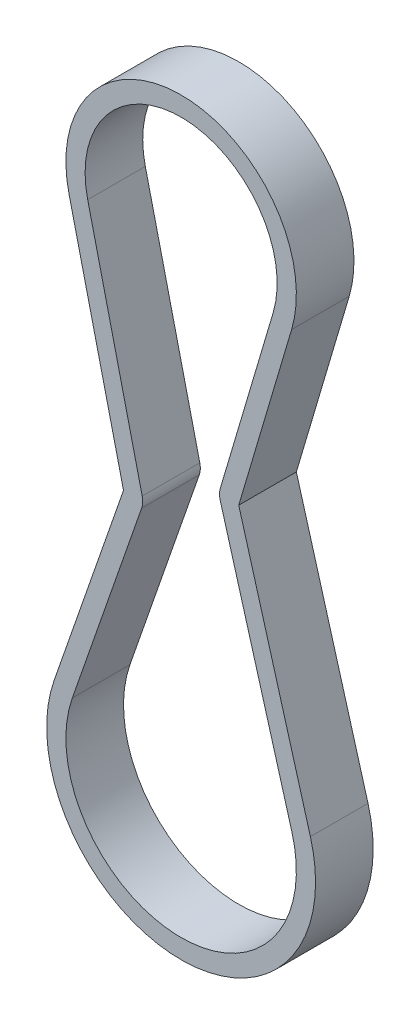
ISO-10303-21;
HEADER;
FILE_DESCRIPTION(('STEP AP214'),'2;1');
FILE_NAME('part.step','',(''),(''),'','','');
FILE_SCHEMA(('AUTOMOTIVE_DESIGN { 1 0 10303 214 1 1 1 1 }'));
ENDSEC;
DATA;
#1=APPLICATION_CONTEXT('core data for automotive mechanical design processes');
#2=APPLICATION_PROTOCOL_DEFINITION('international standard','automotive_design',2000,#1);
#3=PRODUCT_CONTEXT('',#1,'mechanical');
#4=PRODUCT('Part','Part','',(#3));
#5=PRODUCT_RELATED_PRODUCT_CATEGORY('part','',(#4));
#6=PRODUCT_DEFINITION_FORMATION('','',#4);
#7=PRODUCT_DEFINITION_CONTEXT('part definition',#1,'design');
#8=PRODUCT_DEFINITION('design','',#6,#7);
#9=PRODUCT_DEFINITION_SHAPE('','',#8);
#10=(LENGTH_UNIT() NAMED_UNIT(*) SI_UNIT(.MILLI.,.METRE.));
#11=(NAMED_UNIT(*) PLANE_ANGLE_UNIT() SI_UNIT($,.RADIAN.));
#12=(NAMED_UNIT(*) SI_UNIT($,.STERADIAN.) SOLID_ANGLE_UNIT());
#13=UNCERTAINTY_MEASURE_WITH_UNIT(LENGTH_MEASURE(1.E-05),#10,'distance_accuracy_value','');
#14=(GEOMETRIC_REPRESENTATION_CONTEXT(3) GLOBAL_UNCERTAINTY_ASSIGNED_CONTEXT((#13)) GLOBAL_UNIT_ASSIGNED_CONTEXT((#10,
#11,#12)) REPRESENTATION_CONTEXT('',''));
#15=CARTESIAN_POINT('',(0.,0.,0.));
#16=DIRECTION('',(0.,0.,1.));
#17=DIRECTION('',(1.,0.,0.));
#18=AXIS2_PLACEMENT_3D('',#15,#16,#17);
#19=CARTESIAN_POINT('',(17.259086334899,23.4276246371151,9.));
#20=DIRECTION('',(0.958838129716609,-0.283953237350016,0.));
#21=DIRECTION('',(0.283953237350016,0.958838129716609,0.));
#22=AXIS2_PLACEMENT_3D('',#19,#20,#21);
#23=PLANE('',#22);
#24=DIRECTION('',(-0.283953237350016,-0.95883812971661,0.));
#25=VECTOR('',#24,1.);
#26=CARTESIAN_POINT('',(17.259086334899,23.4276246371151,0.));
#27=LINE('',#26,#25);
#28=CARTESIAN_POINT('',(17.259086334899,23.4276246371151,0.));
#29=VERTEX_POINT('',#28);
#30=CARTESIAN_POINT('',(9.00000000000001,-4.46121709058456,0.));
#31=VERTEX_POINT('',#30);
#32=EDGE_CURVE('E187',#29,#31,#27,.T.);
#33=ORIENTED_EDGE('',*,*,#32,.F.);
#34=DIRECTION('',(0.,0.,-1.));
#35=VECTOR('',#34,1.);
#36=CARTESIAN_POINT('',(17.259086334899,23.4276246371151,9.));
#37=LINE('',#36,#35);
#38=CARTESIAN_POINT('',(17.259086334899,23.4276246371151,9.));
#39=VERTEX_POINT('',#38);
#40=EDGE_CURVE('E12',#39,#29,#37,.T.);
#41=ORIENTED_EDGE('',*,*,#40,.F.);
#42=DIRECTION('',(-0.283953237350016,-0.95883812971661,0.));
#43=VECTOR('',#42,1.);
#44=CARTESIAN_POINT('',(17.259086334899,23.4276246371151,9.));
#45=LINE('',#44,#43);
#46=CARTESIAN_POINT('',(9.00000000000001,-4.46121709058456,9.));
#47=VERTEX_POINT('',#46);
#48=EDGE_CURVE('E245',#39,#47,#45,.T.);
#49=ORIENTED_EDGE('',*,*,#48,.T.);
#50=DIRECTION('',(0.,0.,-1.));
#51=VECTOR('',#50,1.);
#52=CARTESIAN_POINT('',(9.00000000000001,-4.46121709058456,9.));
#53=LINE('',#52,#51);
#54=EDGE_CURVE('E80',#47,#31,#53,.T.);
#55=ORIENTED_EDGE('',*,*,#54,.T.);
#56=EDGE_LOOP('',(#33,#41,#49,#55));
#57=FACE_BOUND('',#56,.T.);
#58=ADVANCED_FACE('F77',(#57),#23,.T.);
#59=CARTESIAN_POINT('',(0.,28.5387829094154,9.));
#60=DIRECTION('',(0.,0.,-1.));
#61=DIRECTION('',(-1.,0.,0.));
#62=AXIS2_PLACEMENT_3D('',#59,#60,#61);
#63=CYLINDRICAL_SURFACE('',#62,18.);
#64=CARTESIAN_POINT('',(0.,28.5387829094154,0.));
#65=DIRECTION('',(0.,0.,1.));
#66=DIRECTION('',(1.,0.,0.));
#67=AXIS2_PLACEMENT_3D('',#64,#65,#66);
#68=CIRCLE('',#67,18.);
#69=CARTESIAN_POINT('',(-17.5127818305813,24.3791588212962,0.));
#70=VERTEX_POINT('',#69);
#71=EDGE_CURVE('E249',#29,#70,#68,.T.);
#72=ORIENTED_EDGE('',*,*,#71,.T.);
#73=DIRECTION('',(0.,0.,-1.));
#74=VECTOR('',#73,1.);
#75=CARTESIAN_POINT('',(-17.5127818305813,24.3791588212962,9.));
#76=LINE('',#75,#74);
#77=CARTESIAN_POINT('',(-17.5127818305813,24.3791588212962,9.));
#78=VERTEX_POINT('',#77);
#79=EDGE_CURVE('E85',#78,#70,#76,.T.);
#80=ORIENTED_EDGE('',*,*,#79,.F.);
#81=CARTESIAN_POINT('',(0.,28.5387829094154,9.));
#82=DIRECTION('',(0.,0.,1.));
#83=DIRECTION('',(1.,0.,0.));
#84=AXIS2_PLACEMENT_3D('',#81,#82,#83);
#85=CIRCLE('',#84,18.);
#86=EDGE_CURVE('E258',#39,#78,#85,.T.);
#87=ORIENTED_EDGE('',*,*,#86,.F.);
#88=ORIENTED_EDGE('',*,*,#40,.T.);
#89=EDGE_LOOP('',(#72,#80,#87,#88));
#90=FACE_BOUND('',#89,.T.);
#91=ADVANCED_FACE('F297',(#90),#63,.T.);
#92=CARTESIAN_POINT('',(-17.5127818305813,24.3791588212962,9.));
#93=DIRECTION('',(0.972932323921183,0.231090227117734,0.));
#94=DIRECTION('',(-0.231090227117734,0.972932323921183,0.));
#95=AXIS2_PLACEMENT_3D('',#92,#93,#94);
#96=PLANE('',#95);
#97=DIRECTION('',(0.231090227117734,-0.972932323921183,0.));
#98=VECTOR('',#97,1.);
#99=CARTESIAN_POINT('',(-17.5127818305813,24.3791588212962,0.));
#100=LINE('',#99,#98);
#101=CARTESIAN_POINT('',(-9.,-11.4612170905846,0.));
#102=VERTEX_POINT('',#101);
#103=EDGE_CURVE('E270',#70,#102,#100,.T.);
#104=ORIENTED_EDGE('',*,*,#103,.T.);
#105=DIRECTION('',(0.,0.,-1.));
#106=VECTOR('',#105,1.);
#107=CARTESIAN_POINT('',(-9.,-11.4612170905846,9.));
#108=LINE('',#107,#106);
#109=CARTESIAN_POINT('',(-9.,-11.4612170905846,9.));
#110=VERTEX_POINT('',#109);
#111=EDGE_CURVE('E275',#110,#102,#108,.T.);
#112=ORIENTED_EDGE('',*,*,#111,.F.);
#113=DIRECTION('',(0.231090227117734,-0.972932323921183,0.));
#114=VECTOR('',#113,1.);
#115=CARTESIAN_POINT('',(-17.5127818305813,24.3791588212962,9.));
#116=LINE('',#115,#114);
#117=EDGE_CURVE('E256',#78,#110,#116,.T.);
#118=ORIENTED_EDGE('',*,*,#117,.F.);
#119=ORIENTED_EDGE('',*,*,#79,.T.);
#120=EDGE_LOOP('',(#104,#112,#118,#119));
#121=FACE_BOUND('',#120,.T.);
#122=ADVANCED_FACE('F301',(#121),#96,.F.);
#123=CARTESIAN_POINT('',(-9.,-11.4612170905846,9.));
#124=DIRECTION('',(0.944339606635888,-0.328972198428342,0.));
#125=DIRECTION('',(0.328972198428342,0.944339606635888,0.));
#126=AXIS2_PLACEMENT_3D('',#123,#124,#125);
#127=PLANE('',#126);
#128=DIRECTION('',(-0.328972198428342,-0.944339606635888,0.));
#129=VECTOR('',#128,1.);
#130=CARTESIAN_POINT('',(-9.,-11.4612170905846,0.));
#131=LINE('',#130,#129);
#132=CARTESIAN_POINT('',(-19.8311317393536,-42.5528009235894,0.));
#133=VERTEX_POINT('',#132);
#134=EDGE_CURVE('E268',#102,#133,#131,.T.);
#135=ORIENTED_EDGE('',*,*,#134,.T.);
#136=DIRECTION('',(0.,0.,-1.));
#137=VECTOR('',#136,1.);
#138=CARTESIAN_POINT('',(-19.8311317393536,-42.5528009235894,9.));
#139=LINE('',#138,#137);
#140=CARTESIAN_POINT('',(-19.8311317393536,-42.5528009235894,9.));
#141=VERTEX_POINT('',#140);
#142=EDGE_CURVE('E278',#141,#133,#139,.T.);
#143=ORIENTED_EDGE('',*,*,#142,.F.);
#144=DIRECTION('',(-0.328972198428342,-0.944339606635888,0.));
#145=VECTOR('',#144,1.);
#146=CARTESIAN_POINT('',(-9.,-11.4612170905846,9.));
#147=LINE('',#146,#145);
#148=EDGE_CURVE('E254',#110,#141,#147,.T.);
#149=ORIENTED_EDGE('',*,*,#148,.F.);
#150=ORIENTED_EDGE('',*,*,#111,.T.);
#151=EDGE_LOOP('',(#135,#143,#149,#150));
#152=FACE_BOUND('',#151,.T.);
#153=ADVANCED_FACE('F309',(#152),#127,.F.);
#154=CARTESIAN_POINT('',(0.,-49.4612170905846,9.));
#155=DIRECTION('',(0.,0.,-1.));
#156=DIRECTION('',(-1.,0.,0.));
#157=AXIS2_PLACEMENT_3D('',#154,#155,#156);
#158=CYLINDRICAL_SURFACE('',#157,21.);
#159=CARTESIAN_POINT('',(0.,-49.4612170905846,0.));
#160=DIRECTION('',(0.,0.,1.));
#161=DIRECTION('',(1.,0.,0.));
#162=AXIS2_PLACEMENT_3D('',#159,#160,#161);
#163=CIRCLE('',#162,21.);
#164=CARTESIAN_POINT('',(20.1942872232977,-43.7000745352441,0.));
#165=VERTEX_POINT('',#164);
#166=EDGE_CURVE('E265',#133,#165,#163,.T.);
#167=ORIENTED_EDGE('',*,*,#166,.T.);
#168=DIRECTION('',(0.,0.,-1.));
#169=VECTOR('',#168,1.);
#170=CARTESIAN_POINT('',(20.1942872232977,-43.7000745352441,9.));
#171=LINE('',#170,#169);
#172=CARTESIAN_POINT('',(20.1942872232977,-43.7000745352441,9.));
#173=VERTEX_POINT('',#172);
#174=EDGE_CURVE('E280',#173,#165,#171,.T.);
#175=ORIENTED_EDGE('',*,*,#174,.F.);
#176=CARTESIAN_POINT('',(0.,-49.4612170905846,9.));
#177=DIRECTION('',(0.,0.,1.));
#178=DIRECTION('',(1.,0.,0.));
#179=AXIS2_PLACEMENT_3D('',#176,#177,#178);
#180=CIRCLE('',#179,21.);
#181=EDGE_CURVE('E252',#141,#173,#180,.T.);
#182=ORIENTED_EDGE('',*,*,#181,.F.);
#183=ORIENTED_EDGE('',*,*,#142,.T.);
#184=EDGE_LOOP('',(#167,#175,#182,#183));
#185=FACE_BOUND('',#184,.T.);
#186=ADVANCED_FACE('F307',(#185),#158,.T.);
#187=CARTESIAN_POINT('',(9.00000000000001,-4.46121709058456,9.));
#188=DIRECTION('',(0.961632724918939,0.274340121682879,0.));
#189=DIRECTION('',(-0.274340121682879,0.961632724918939,0.));
#190=AXIS2_PLACEMENT_3D('',#187,#188,#189);
#191=PLANE('',#190);
#192=DIRECTION('',(0.274340121682879,-0.961632724918939,0.));
#193=VECTOR('',#192,1.);
#194=CARTESIAN_POINT('',(9.00000000000001,-4.46121709058456,0.));
#195=LINE('',#194,#193);
#196=EDGE_CURVE('E262',#31,#165,#195,.T.);
#197=ORIENTED_EDGE('',*,*,#196,.F.);
#198=ORIENTED_EDGE('',*,*,#54,.F.);
#199=DIRECTION('',(0.274340121682879,-0.961632724918939,0.));
#200=VECTOR('',#199,1.);
#201=CARTESIAN_POINT('',(9.00000000000001,-4.46121709058456,9.));
#202=LINE('',#201,#200);
#203=EDGE_CURVE('E248',#47,#173,#202,.T.);
#204=ORIENTED_EDGE('',*,*,#203,.T.);
#205=ORIENTED_EDGE('',*,*,#174,.T.);
#206=EDGE_LOOP('',(#197,#198,#204,#205));
#207=FACE_BOUND('',#206,.T.);
#208=ADVANCED_FACE('F288',(#207),#191,.T.);
#209=CARTESIAN_POINT('',(0.,-49.4612170905846,9.));
#210=DIRECTION('',(0.,0.,1.));
#211=DIRECTION('',(1.,0.,0.));
#212=AXIS2_PLACEMENT_3D('',#209,#210,#211);
#213=PLANE('',#212);
#214=CARTESIAN_POINT('',(9.,-4.46121709058456,9.));
#215=DIRECTION('',(0.,0.,1.));
#216=DIRECTION('',(1.,0.,0.));
#217=AXIS2_PLACEMENT_3D('',#214,#215,#216);
#218=CIRCLE('',#217,3.);
#219=CARTESIAN_POINT('',(6.12348561085017,-3.60935737853452,9.));
#220=VERTEX_POINT('',#219);
#221=CARTESIAN_POINT('',(6.11510182524319,-5.2842374556332,9.));
#222=VERTEX_POINT('',#221);
#223=EDGE_CURVE('E191',#220,#222,#218,.T.);
#224=ORIENTED_EDGE('',*,*,#223,.T.);
#225=DIRECTION('',(0.274340121682879,-0.961632724918939,0.));
#226=VECTOR('',#225,1.);
#227=CARTESIAN_POINT('',(4.26080582098139,1.21554722203707,9.));
#228=LINE('',#227,#226);
#229=CARTESIAN_POINT('',(17.3093890485409,-44.5230949002928,9.));
#230=VERTEX_POINT('',#229);
#231=EDGE_CURVE('E214',#222,#230,#228,.T.);
#232=ORIENTED_EDGE('',*,*,#231,.T.);
#233=CARTESIAN_POINT('',(0.,-49.4612170905846,9.));
#234=DIRECTION('',(0.,0.,1.));
#235=DIRECTION('',(1.,0.,0.));
#236=AXIS2_PLACEMENT_3D('',#233,#234,#235);
#237=CIRCLE('',#236,18.);
#238=CARTESIAN_POINT('',(-16.998112919446,-43.5397175188744,9.));
#239=VERTEX_POINT('',#238);
#240=EDGE_CURVE('E212',#239,#230,#237,.T.);
#241=ORIENTED_EDGE('',*,*,#240,.F.);
#242=DIRECTION('',(-0.328972198428342,-0.944339606635888,0.));
#243=VECTOR('',#242,1.);
#244=CARTESIAN_POINT('',(-1.6324181906771,0.568672749896131,9.));
#245=LINE('',#244,#243);
#246=CARTESIAN_POINT('',(-6.16698118009233,-12.4481336858696,9.));
#247=VERTEX_POINT('',#246);
#248=EDGE_CURVE('E210',#247,#239,#245,.T.);
#249=ORIENTED_EDGE('',*,*,#248,.F.);
#250=CARTESIAN_POINT('',(-8.99999999999999,-11.4612170905846,9.));
#251=DIRECTION('',(0.,0.,1.));
#252=DIRECTION('',(1.,0.,0.));
#253=AXIS2_PLACEMENT_3D('',#250,#251,#252);
#254=CIRCLE('',#253,3.);
#255=CARTESIAN_POINT('',(-6.08120302823645,-10.7679464092314,9.));
#256=VERTEX_POINT('',#255);
#257=EDGE_CURVE('E207',#247,#256,#254,.T.);
#258=ORIENTED_EDGE('',*,*,#257,.T.);
#259=DIRECTION('',(0.231090227117734,-0.972932323921183,0.));
#260=VECTOR('',#259,1.);
#261=CARTESIAN_POINT('',(-8.17746327389953,-1.94230554248237,9.));
#262=LINE('',#261,#260);
#263=CARTESIAN_POINT('',(-14.5939848588177,25.0724295026494,9.));
#264=VERTEX_POINT('',#263);
#265=EDGE_CURVE('E203',#264,#256,#262,.T.);
#266=ORIENTED_EDGE('',*,*,#265,.F.);
#267=CARTESIAN_POINT('',(0.,28.5387829094154,9.));
#268=DIRECTION('',(0.,0.,1.));
#269=DIRECTION('',(1.,0.,0.));
#270=AXIS2_PLACEMENT_3D('',#267,#268,#269);
#271=CIRCLE('',#270,15.);
#272=CARTESIAN_POINT('',(14.3825719457491,24.2794843491652,9.));
#273=VERTEX_POINT('',#272);
#274=EDGE_CURVE('E201',#273,#264,#271,.T.);
#275=ORIENTED_EDGE('',*,*,#274,.F.);
#276=DIRECTION('',(-0.283953237350016,-0.95883812971661,0.));
#277=VECTOR('',#276,1.);
#278=CARTESIAN_POINT('',(6.61245476522007,-1.95823244739936,9.));
#279=LINE('',#278,#277);
#280=EDGE_CURVE('E183',#273,#220,#279,.T.);
#281=ORIENTED_EDGE('',*,*,#280,.T.);
#282=EDGE_LOOP('',(#224,#232,#241,#249,#258,#266,#275,#281));
#283=FACE_BOUND('',#282,.T.);
#284=ORIENTED_EDGE('',*,*,#48,.F.);
#285=ORIENTED_EDGE('',*,*,#86,.T.);
#286=ORIENTED_EDGE('',*,*,#117,.T.);
#287=ORIENTED_EDGE('',*,*,#148,.T.);
#288=ORIENTED_EDGE('',*,*,#181,.T.);
#289=ORIENTED_EDGE('',*,*,#203,.F.);
#290=EDGE_LOOP('',(#284,#285,#286,#287,#288,#289));
#291=FACE_BOUND('',#290,.T.);
#292=ADVANCED_FACE('F198',(#283,#291),#213,.T.);
#293=CARTESIAN_POINT('',(0.,-49.4612170905846,0.));
#294=DIRECTION('',(0.,0.,1.));
#295=DIRECTION('',(1.,0.,0.));
#296=AXIS2_PLACEMENT_3D('',#293,#294,#295);
#297=PLANE('',#296);
#298=DIRECTION('',(0.274340121682879,-0.961632724918939,0.));
#299=VECTOR('',#298,1.);
#300=CARTESIAN_POINT('',(4.26080582098139,1.21554722203707,0.));
#301=LINE('',#300,#299);
#302=CARTESIAN_POINT('',(6.11510182524319,-5.2842374556332,0.));
#303=VERTEX_POINT('',#302);
#304=CARTESIAN_POINT('',(17.3093890485409,-44.5230949002928,0.));
#305=VERTEX_POINT('',#304);
#306=EDGE_CURVE('E196',#303,#305,#301,.T.);
#307=ORIENTED_EDGE('',*,*,#306,.F.);
#308=CARTESIAN_POINT('',(9.,-4.46121709058456,0.));
#309=DIRECTION('',(0.,0.,1.));
#310=DIRECTION('',(1.,0.,0.));
#311=AXIS2_PLACEMENT_3D('',#308,#309,#310);
#312=CIRCLE('',#311,3.);
#313=CARTESIAN_POINT('',(6.12348561085017,-3.60935737853452,0.));
#314=VERTEX_POINT('',#313);
#315=EDGE_CURVE('E101',#314,#303,#312,.T.);
#316=ORIENTED_EDGE('',*,*,#315,.F.);
#317=DIRECTION('',(-0.283953237350016,-0.95883812971661,0.));
#318=VECTOR('',#317,1.);
#319=CARTESIAN_POINT('',(6.61245476522007,-1.95823244739936,0.));
#320=LINE('',#319,#318);
#321=CARTESIAN_POINT('',(14.3825719457491,24.2794843491652,0.));
#322=VERTEX_POINT('',#321);
#323=EDGE_CURVE('E186',#322,#314,#320,.T.);
#324=ORIENTED_EDGE('',*,*,#323,.F.);
#325=CARTESIAN_POINT('',(0.,28.5387829094154,0.));
#326=DIRECTION('',(0.,0.,1.));
#327=DIRECTION('',(1.,0.,0.));
#328=AXIS2_PLACEMENT_3D('',#325,#326,#327);
#329=CIRCLE('',#328,15.);
#330=CARTESIAN_POINT('',(-14.5939848588177,25.0724295026494,0.));
#331=VERTEX_POINT('',#330);
#332=EDGE_CURVE('E218',#322,#331,#329,.T.);
#333=ORIENTED_EDGE('',*,*,#332,.T.);
#334=DIRECTION('',(0.231090227117734,-0.972932323921183,0.));
#335=VECTOR('',#334,1.);
#336=CARTESIAN_POINT('',(-8.17746327389953,-1.94230554248237,0.));
#337=LINE('',#336,#335);
#338=CARTESIAN_POINT('',(-6.08120302823645,-10.7679464092314,0.));
#339=VERTEX_POINT('',#338);
#340=EDGE_CURVE('E221',#331,#339,#337,.T.);
#341=ORIENTED_EDGE('',*,*,#340,.T.);
#342=CARTESIAN_POINT('',(-8.99999999999999,-11.4612170905846,0.));
#343=DIRECTION('',(0.,0.,1.));
#344=DIRECTION('',(1.,0.,0.));
#345=AXIS2_PLACEMENT_3D('',#342,#343,#344);
#346=CIRCLE('',#345,3.);
#347=CARTESIAN_POINT('',(-6.16698118009233,-12.4481336858696,0.));
#348=VERTEX_POINT('',#347);
#349=EDGE_CURVE('E224',#348,#339,#346,.T.);
#350=ORIENTED_EDGE('',*,*,#349,.F.);
#351=DIRECTION('',(-0.328972198428342,-0.944339606635888,0.));
#352=VECTOR('',#351,1.);
#353=CARTESIAN_POINT('',(-1.6324181906771,0.568672749896131,0.));
#354=LINE('',#353,#352);
#355=CARTESIAN_POINT('',(-16.998112919446,-43.5397175188744,0.));
#356=VERTEX_POINT('',#355);
#357=EDGE_CURVE('E227',#348,#356,#354,.T.);
#358=ORIENTED_EDGE('',*,*,#357,.T.);
#359=CARTESIAN_POINT('',(0.,-49.4612170905846,0.));
#360=DIRECTION('',(0.,0.,1.));
#361=DIRECTION('',(1.,0.,0.));
#362=AXIS2_PLACEMENT_3D('',#359,#360,#361);
#363=CIRCLE('',#362,18.);
#364=EDGE_CURVE('E230',#356,#305,#363,.T.);
#365=ORIENTED_EDGE('',*,*,#364,.T.);
#366=EDGE_LOOP('',(#307,#316,#324,#333,#341,#350,#358,#365));
#367=FACE_BOUND('',#366,.T.);
#368=ORIENTED_EDGE('',*,*,#32,.T.);
#369=ORIENTED_EDGE('',*,*,#196,.T.);
#370=ORIENTED_EDGE('',*,*,#166,.F.);
#371=ORIENTED_EDGE('',*,*,#134,.F.);
#372=ORIENTED_EDGE('',*,*,#103,.F.);
#373=ORIENTED_EDGE('',*,*,#71,.F.);
#374=EDGE_LOOP('',(#368,#369,#370,#371,#372,#373));
#375=FACE_BOUND('',#374,.T.);
#376=ADVANCED_FACE('F292',(#367,#375),#297,.F.);
#377=CARTESIAN_POINT('',(9.,-4.46121709058456,9.));
#378=DIRECTION('',(0.,0.,-1.));
#379=DIRECTION('',(-1.,0.,0.));
#380=AXIS2_PLACEMENT_3D('',#377,#378,#379);
#381=CYLINDRICAL_SURFACE('',#380,3.);
#382=ORIENTED_EDGE('',*,*,#315,.T.);
#383=DIRECTION('',(0.,0.,-1.));
#384=VECTOR('',#383,1.);
#385=CARTESIAN_POINT('',(6.11510182524319,-5.2842374556332,9.));
#386=LINE('',#385,#384);
#387=EDGE_CURVE('E193',#222,#303,#386,.T.);
#388=ORIENTED_EDGE('',*,*,#387,.F.);
#389=ORIENTED_EDGE('',*,*,#223,.F.);
#390=DIRECTION('',(0.,0.,-1.));
#391=VECTOR('',#390,1.);
#392=CARTESIAN_POINT('',(6.12348561085017,-3.60935737853452,9.));
#393=LINE('',#392,#391);
#394=EDGE_CURVE('E179',#220,#314,#393,.T.);
#395=ORIENTED_EDGE('',*,*,#394,.T.);
#396=EDGE_LOOP('',(#382,#388,#389,#395));
#397=FACE_BOUND('',#396,.T.);
#398=ADVANCED_FACE('F192',(#397),#381,.T.);
#399=CARTESIAN_POINT('',(6.61245476522007,-1.95823244739936,9.));
#400=DIRECTION('',(0.958838129716609,-0.283953237350016,0.));
#401=DIRECTION('',(0.283953237350016,0.958838129716609,0.));
#402=AXIS2_PLACEMENT_3D('',#399,#400,#401);
#403=PLANE('',#402);
#404=ORIENTED_EDGE('',*,*,#323,.T.);
#405=ORIENTED_EDGE('',*,*,#394,.F.);
#406=ORIENTED_EDGE('',*,*,#280,.F.);
#407=DIRECTION('',(0.,0.,-1.));
#408=VECTOR('',#407,1.);
#409=CARTESIAN_POINT('',(14.3825719457491,24.2794843491652,9.));
#410=LINE('',#409,#408);
#411=EDGE_CURVE('E188',#273,#322,#410,.T.);
#412=ORIENTED_EDGE('',*,*,#411,.T.);
#413=EDGE_LOOP('',(#404,#405,#406,#412));
#414=FACE_BOUND('',#413,.T.);
#415=ADVANCED_FACE('F181',(#414),#403,.F.);
#416=CARTESIAN_POINT('',(0.,28.5387829094154,9.));
#417=DIRECTION('',(0.,0.,-1.));
#418=DIRECTION('',(-1.,0.,0.));
#419=AXIS2_PLACEMENT_3D('',#416,#417,#418);
#420=CYLINDRICAL_SURFACE('',#419,15.);
#421=ORIENTED_EDGE('',*,*,#332,.F.);
#422=ORIENTED_EDGE('',*,*,#411,.F.);
#423=ORIENTED_EDGE('',*,*,#274,.T.);
#424=DIRECTION('',(0.,0.,-1.));
#425=VECTOR('',#424,1.);
#426=CARTESIAN_POINT('',(-14.5939848588177,25.0724295026494,9.));
#427=LINE('',#426,#425);
#428=EDGE_CURVE('E242',#264,#331,#427,.T.);
#429=ORIENTED_EDGE('',*,*,#428,.T.);
#430=EDGE_LOOP('',(#421,#422,#423,#429));
#431=FACE_BOUND('',#430,.T.);
#432=ADVANCED_FACE('F335',(#431),#420,.F.);
#433=CARTESIAN_POINT('',(-8.17746327389953,-1.94230554248237,9.));
#434=DIRECTION('',(0.972932323921183,0.231090227117734,0.));
#435=DIRECTION('',(-0.231090227117734,0.972932323921183,0.));
#436=AXIS2_PLACEMENT_3D('',#433,#434,#435);
#437=PLANE('',#436);
#438=ORIENTED_EDGE('',*,*,#340,.F.);
#439=ORIENTED_EDGE('',*,*,#428,.F.);
#440=ORIENTED_EDGE('',*,*,#265,.T.);
#441=DIRECTION('',(0.,0.,-1.));
#442=VECTOR('',#441,1.);
#443=CARTESIAN_POINT('',(-6.08120302823645,-10.7679464092314,9.));
#444=LINE('',#443,#442);
#445=EDGE_CURVE('E240',#256,#339,#444,.T.);
#446=ORIENTED_EDGE('',*,*,#445,.T.);
#447=EDGE_LOOP('',(#438,#439,#440,#446));
#448=FACE_BOUND('',#447,.T.);
#449=ADVANCED_FACE('F338',(#448),#437,.T.);
#450=CARTESIAN_POINT('',(-8.99999999999999,-11.4612170905846,9.));
#451=DIRECTION('',(0.,0.,-1.));
#452=DIRECTION('',(-1.,0.,0.));
#453=AXIS2_PLACEMENT_3D('',#450,#451,#452);
#454=CYLINDRICAL_SURFACE('',#453,3.);
#455=ORIENTED_EDGE('',*,*,#349,.T.);
#456=ORIENTED_EDGE('',*,*,#445,.F.);
#457=ORIENTED_EDGE('',*,*,#257,.F.);
#458=DIRECTION('',(0.,0.,-1.));
#459=VECTOR('',#458,1.);
#460=CARTESIAN_POINT('',(-6.16698118009233,-12.4481336858696,9.));
#461=LINE('',#460,#459);
#462=EDGE_CURVE('E238',#247,#348,#461,.T.);
#463=ORIENTED_EDGE('',*,*,#462,.T.);
#464=EDGE_LOOP('',(#455,#456,#457,#463));
#465=FACE_BOUND('',#464,.T.);
#466=ADVANCED_FACE('F342',(#465),#454,.T.);
#467=CARTESIAN_POINT('',(-1.6324181906771,0.568672749896131,9.));
#468=DIRECTION('',(0.944339606635888,-0.328972198428342,0.));
#469=DIRECTION('',(0.328972198428342,0.944339606635888,0.));
#470=AXIS2_PLACEMENT_3D('',#467,#468,#469);
#471=PLANE('',#470);
#472=ORIENTED_EDGE('',*,*,#357,.F.);
#473=ORIENTED_EDGE('',*,*,#462,.F.);
#474=ORIENTED_EDGE('',*,*,#248,.T.);
#475=DIRECTION('',(0.,0.,-1.));
#476=VECTOR('',#475,1.);
#477=CARTESIAN_POINT('',(-16.998112919446,-43.5397175188744,9.));
#478=LINE('',#477,#476);
#479=EDGE_CURVE('E236',#239,#356,#478,.T.);
#480=ORIENTED_EDGE('',*,*,#479,.T.);
#481=EDGE_LOOP('',(#472,#473,#474,#480));
#482=FACE_BOUND('',#481,.T.);
#483=ADVANCED_FACE('F346',(#482),#471,.T.);
#484=CARTESIAN_POINT('',(0.,-49.4612170905846,9.));
#485=DIRECTION('',(0.,0.,-1.));
#486=DIRECTION('',(-1.,0.,0.));
#487=AXIS2_PLACEMENT_3D('',#484,#485,#486);
#488=CYLINDRICAL_SURFACE('',#487,18.);
#489=ORIENTED_EDGE('',*,*,#364,.F.);
#490=ORIENTED_EDGE('',*,*,#479,.F.);
#491=ORIENTED_EDGE('',*,*,#240,.T.);
#492=DIRECTION('',(0.,0.,-1.));
#493=VECTOR('',#492,1.);
#494=CARTESIAN_POINT('',(17.3093890485409,-44.5230949002928,9.));
#495=LINE('',#494,#493);
#496=EDGE_CURVE('E93',#230,#305,#495,.T.);
#497=ORIENTED_EDGE('',*,*,#496,.T.);
#498=EDGE_LOOP('',(#489,#490,#491,#497));
#499=FACE_BOUND('',#498,.T.);
#500=ADVANCED_FACE('F350',(#499),#488,.F.);
#501=CARTESIAN_POINT('',(4.26080582098139,1.21554722203707,9.));
#502=DIRECTION('',(0.961632724918939,0.274340121682879,0.));
#503=DIRECTION('',(-0.274340121682879,0.961632724918939,0.));
#504=AXIS2_PLACEMENT_3D('',#501,#502,#503);
#505=PLANE('',#504);
#506=ORIENTED_EDGE('',*,*,#306,.T.);
#507=ORIENTED_EDGE('',*,*,#496,.F.);
#508=ORIENTED_EDGE('',*,*,#231,.F.);
#509=ORIENTED_EDGE('',*,*,#387,.T.);
#510=EDGE_LOOP('',(#506,#507,#508,#509));
#511=FACE_BOUND('',#510,.T.);
#512=ADVANCED_FACE('F354',(#511),#505,.F.);
#513=CLOSED_SHELL('',(#58,#91,#122,#153,#186,#208,#292,#376,#398,#415,#432,#449,#466,#483,#500,#512));
#514=MANIFOLD_SOLID_BREP('B2',#513);
#515=ADVANCED_BREP_SHAPE_REPRESENTATION('',(#18,#514),#14);
#516=SHAPE_DEFINITION_REPRESENTATION(#9,#515);
ENDSEC;
END-ISO-10303-21;
